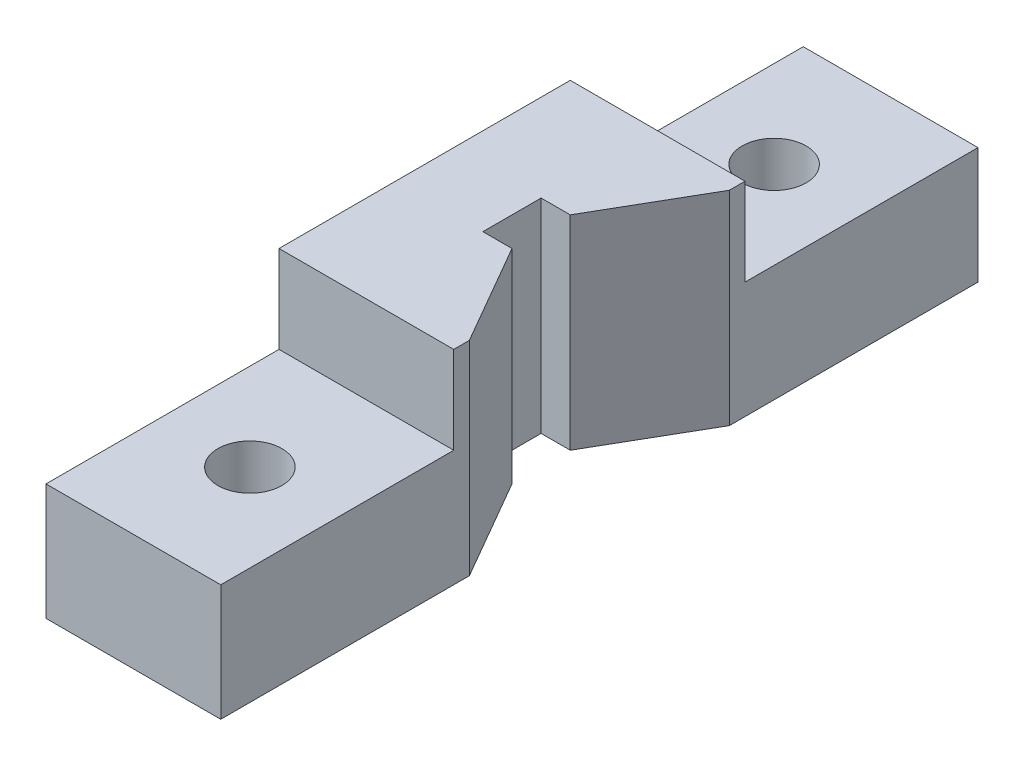
ISO-10303-21;
HEADER;
FILE_DESCRIPTION(('STEP AP214'),'2;1');
FILE_NAME('part.step','',(''),(''),'','','');
FILE_SCHEMA(('AUTOMOTIVE_DESIGN { 1 0 10303 214 1 1 1 1 }'));
ENDSEC;
DATA;
#1=APPLICATION_CONTEXT('core data for automotive mechanical design processes');
#2=APPLICATION_PROTOCOL_DEFINITION('international standard','automotive_design',2000,#1);
#3=PRODUCT_CONTEXT('',#1,'mechanical');
#4=PRODUCT('Part','Part','',(#3));
#5=PRODUCT_RELATED_PRODUCT_CATEGORY('part','',(#4));
#6=PRODUCT_DEFINITION_FORMATION('','',#4);
#7=PRODUCT_DEFINITION_CONTEXT('part definition',#1,'design');
#8=PRODUCT_DEFINITION('design','',#6,#7);
#9=PRODUCT_DEFINITION_SHAPE('','',#8);
#10=(LENGTH_UNIT() NAMED_UNIT(*) SI_UNIT(.MILLI.,.METRE.));
#11=(NAMED_UNIT(*) PLANE_ANGLE_UNIT() SI_UNIT($,.RADIAN.));
#12=(NAMED_UNIT(*) SI_UNIT($,.STERADIAN.) SOLID_ANGLE_UNIT());
#13=UNCERTAINTY_MEASURE_WITH_UNIT(LENGTH_MEASURE(1.E-05),#10,'distance_accuracy_value','');
#14=(GEOMETRIC_REPRESENTATION_CONTEXT(3) GLOBAL_UNCERTAINTY_ASSIGNED_CONTEXT((#13)) GLOBAL_UNIT_ASSIGNED_CONTEXT((#10,
#11,#12)) REPRESENTATION_CONTEXT('',''));
#15=CARTESIAN_POINT('',(0.,0.,0.));
#16=DIRECTION('',(0.,0.,1.));
#17=DIRECTION('',(1.,0.,0.));
#18=AXIS2_PLACEMENT_3D('',#15,#16,#17);
#19=CARTESIAN_POINT('',(0.,50.,35.));
#20=DIRECTION('',(0.,1.,0.));
#21=DIRECTION('',(0.,0.,1.));
#22=AXIS2_PLACEMENT_3D('',#19,#20,#21);
#23=PLANE('',#22);
#24=CARTESIAN_POINT('',(15.,50.,145.));
#25=DIRECTION('',(0.,1.,0.));
#26=DIRECTION('',(0.,0.,1.));
#27=AXIS2_PLACEMENT_3D('',#24,#25,#26);
#28=CIRCLE('',#27,5.5);
#29=CARTESIAN_POINT('',(15.,50.,150.5));
#30=VERTEX_POINT('',#29);
#31=EDGE_CURVE('E11',#30,#30,#28,.T.);
#32=ORIENTED_EDGE('',*,*,#31,.T.);
#33=EDGE_LOOP('',(#32));
#34=FACE_BOUND('',#33,.T.);
#35=CARTESIAN_POINT('',(15.,50.,55.));
#36=DIRECTION('',(0.,1.,0.));
#37=DIRECTION('',(0.,0.,1.));
#38=AXIS2_PLACEMENT_3D('',#35,#36,#37);
#39=CIRCLE('',#38,5.5);
#40=CARTESIAN_POINT('',(15.,50.,60.5));
#41=VERTEX_POINT('',#40);
#42=EDGE_CURVE('E52',#41,#41,#39,.T.);
#43=ORIENTED_EDGE('',*,*,#42,.T.);
#44=EDGE_LOOP('',(#43));
#45=FACE_BOUND('',#44,.T.);
#46=DIRECTION('',(0.,0.,1.));
#47=VECTOR('',#46,1.);
#48=CARTESIAN_POINT('',(0.,50.,200.));
#49=LINE('',#48,#47);
#50=CARTESIAN_POINT('',(0.,50.,35.));
#51=VERTEX_POINT('',#50);
#52=CARTESIAN_POINT('',(0.,50.,165.));
#53=VERTEX_POINT('',#52);
#54=EDGE_CURVE('E48',#51,#53,#49,.T.);
#55=ORIENTED_EDGE('',*,*,#54,.F.);
#56=DIRECTION('',(1.,0.,0.));
#57=VECTOR('',#56,1.);
#58=CARTESIAN_POINT('',(0.,50.,35.));
#59=LINE('',#58,#57);
#60=CARTESIAN_POINT('',(30.,50.,35.));
#61=VERTEX_POINT('',#60);
#62=EDGE_CURVE('E62',#51,#61,#59,.T.);
#63=ORIENTED_EDGE('',*,*,#62,.T.);
#64=DIRECTION('',(0.,0.,-1.));
#65=VECTOR('',#64,1.);
#66=CARTESIAN_POINT('',(30.,50.,75.));
#67=LINE('',#66,#65);
#68=CARTESIAN_POINT('',(30.,50.,77.6794919243111));
#69=VERTEX_POINT('',#68);
#70=EDGE_CURVE('E66',#69,#61,#67,.T.);
#71=ORIENTED_EDGE('',*,*,#70,.F.);
#72=DIRECTION('',(0.499999999999998,0.,-0.86602540378444));
#73=VECTOR('',#72,1.);
#74=CARTESIAN_POINT('',(30.,50.,77.6794919243111));
#75=LINE('',#74,#73);
#76=CARTESIAN_POINT('',(20.,50.,95.));
#77=VERTEX_POINT('',#76);
#78=EDGE_CURVE('E237',#77,#69,#75,.T.);
#79=ORIENTED_EDGE('',*,*,#78,.F.);
#80=DIRECTION('',(1.,0.,0.));
#81=VECTOR('',#80,1.);
#82=CARTESIAN_POINT('',(20.,50.,95.));
#83=LINE('',#82,#81);
#84=CARTESIAN_POINT('',(15.,50.,95.));
#85=VERTEX_POINT('',#84);
#86=EDGE_CURVE('E240',#85,#77,#83,.T.);
#87=ORIENTED_EDGE('',*,*,#86,.F.);
#88=DIRECTION('',(0.,0.,-1.));
#89=VECTOR('',#88,1.);
#90=CARTESIAN_POINT('',(15.,50.,95.));
#91=LINE('',#90,#89);
#92=CARTESIAN_POINT('',(15.,50.,105.));
#93=VERTEX_POINT('',#92);
#94=EDGE_CURVE('E232',#93,#85,#91,.T.);
#95=ORIENTED_EDGE('',*,*,#94,.F.);
#96=DIRECTION('',(-1.,0.,0.));
#97=VECTOR('',#96,1.);
#98=CARTESIAN_POINT('',(20.,50.,105.));
#99=LINE('',#98,#97);
#100=CARTESIAN_POINT('',(20.,50.,105.));
#101=VERTEX_POINT('',#100);
#102=EDGE_CURVE('E231',#101,#93,#99,.T.);
#103=ORIENTED_EDGE('',*,*,#102,.F.);
#104=DIRECTION('',(-0.499999999999998,0.,-0.86602540378444));
#105=VECTOR('',#104,1.);
#106=CARTESIAN_POINT('',(30.,50.,122.320508075689));
#107=LINE('',#106,#105);
#108=CARTESIAN_POINT('',(30.,50.,122.320508075689));
#109=VERTEX_POINT('',#108);
#110=EDGE_CURVE('E233',#109,#101,#107,.T.);
#111=ORIENTED_EDGE('',*,*,#110,.F.);
#112=DIRECTION('',(0.,0.,-1.));
#113=VECTOR('',#112,1.);
#114=CARTESIAN_POINT('',(30.,50.,122.320508075689));
#115=LINE('',#114,#113);
#116=CARTESIAN_POINT('',(30.,50.,165.));
#117=VERTEX_POINT('',#116);
#118=EDGE_CURVE('E189',#117,#109,#115,.T.);
#119=ORIENTED_EDGE('',*,*,#118,.F.);
#120=DIRECTION('',(1.,0.,0.));
#121=VECTOR('',#120,1.);
#122=CARTESIAN_POINT('',(0.,50.,165.));
#123=LINE('',#122,#121);
#124=EDGE_CURVE('E194',#53,#117,#123,.T.);
#125=ORIENTED_EDGE('',*,*,#124,.F.);
#126=EDGE_LOOP('',(#55,#63,#71,#79,#87,#95,#103,#111,#119,#125));
#127=FACE_BOUND('',#126,.T.);
#128=ADVANCED_FACE('F44',(#34,#45,#127),#23,.F.);
#129=CARTESIAN_POINT('',(0.,85.,125.));
#130=DIRECTION('',(0.,0.,-1.));
#131=DIRECTION('',(-1.,0.,0.));
#132=AXIS2_PLACEMENT_3D('',#129,#130,#131);
#133=PLANE('',#132);
#134=DIRECTION('',(-1.,0.,0.));
#135=VECTOR('',#134,1.);
#136=CARTESIAN_POINT('',(0.,70.,125.));
#137=LINE('',#136,#135);
#138=CARTESIAN_POINT('',(30.,70.,125.));
#139=VERTEX_POINT('',#138);
#140=CARTESIAN_POINT('',(0.,70.,125.));
#141=VERTEX_POINT('',#140);
#142=EDGE_CURVE('E197',#139,#141,#137,.T.);
#143=ORIENTED_EDGE('',*,*,#142,.F.);
#144=DIRECTION('',(0.,-1.,0.));
#145=VECTOR('',#144,1.);
#146=CARTESIAN_POINT('',(30.,85.,125.));
#147=LINE('',#146,#145);
#148=CARTESIAN_POINT('',(30.,85.,125.));
#149=VERTEX_POINT('',#148);
#150=EDGE_CURVE('E256',#149,#139,#147,.T.);
#151=ORIENTED_EDGE('',*,*,#150,.F.);
#152=DIRECTION('',(1.,0.,0.));
#153=VECTOR('',#152,1.);
#154=CARTESIAN_POINT('',(0.,85.,125.));
#155=LINE('',#154,#153);
#156=CARTESIAN_POINT('',(0.,85.,125.));
#157=VERTEX_POINT('',#156);
#158=EDGE_CURVE('E214',#157,#149,#155,.T.);
#159=ORIENTED_EDGE('',*,*,#158,.F.);
#160=DIRECTION('',(0.,-1.,0.));
#161=VECTOR('',#160,1.);
#162=CARTESIAN_POINT('',(0.,85.,125.));
#163=LINE('',#162,#161);
#164=EDGE_CURVE('E262',#157,#141,#163,.T.);
#165=ORIENTED_EDGE('',*,*,#164,.T.);
#166=EDGE_LOOP('',(#143,#151,#159,#165));
#167=FACE_BOUND('',#166,.T.);
#168=ADVANCED_FACE('F305',(#167),#133,.F.);
#169=CARTESIAN_POINT('',(30.,85.,122.320508075689));
#170=DIRECTION('',(-0.86602540378444,0.,0.499999999999998));
#171=DIRECTION('',(0.499999999999998,0.,0.86602540378444));
#172=AXIS2_PLACEMENT_3D('',#169,#170,#171);
#173=PLANE('',#172);
#174=ORIENTED_EDGE('',*,*,#110,.T.);
#175=DIRECTION('',(0.,-1.,0.));
#176=VECTOR('',#175,1.);
#177=CARTESIAN_POINT('',(20.,85.,105.));
#178=LINE('',#177,#176);
#179=CARTESIAN_POINT('',(20.,85.,105.));
#180=VERTEX_POINT('',#179);
#181=EDGE_CURVE('E254',#180,#101,#178,.T.);
#182=ORIENTED_EDGE('',*,*,#181,.F.);
#183=DIRECTION('',(-0.499999999999998,0.,-0.86602540378444));
#184=VECTOR('',#183,1.);
#185=CARTESIAN_POINT('',(30.,85.,122.320508075689));
#186=LINE('',#185,#184);
#187=CARTESIAN_POINT('',(30.,85.,122.320508075689));
#188=VERTEX_POINT('',#187);
#189=EDGE_CURVE('E220',#188,#180,#186,.T.);
#190=ORIENTED_EDGE('',*,*,#189,.F.);
#191=DIRECTION('',(0.,-1.,0.));
#192=VECTOR('',#191,1.);
#193=CARTESIAN_POINT('',(30.,85.,122.320508075689));
#194=LINE('',#193,#192);
#195=EDGE_CURVE('E257',#188,#109,#194,.T.);
#196=ORIENTED_EDGE('',*,*,#195,.T.);
#197=EDGE_LOOP('',(#174,#182,#190,#196));
#198=FACE_BOUND('',#197,.T.);
#199=ADVANCED_FACE('F307',(#198),#173,.F.);
#200=CARTESIAN_POINT('',(20.,85.,105.));
#201=DIRECTION('',(0.,0.,1.));
#202=DIRECTION('',(1.,0.,0.));
#203=AXIS2_PLACEMENT_3D('',#200,#201,#202);
#204=PLANE('',#203);
#205=ORIENTED_EDGE('',*,*,#102,.T.);
#206=DIRECTION('',(0.,-1.,0.));
#207=VECTOR('',#206,1.);
#208=CARTESIAN_POINT('',(15.,85.,105.));
#209=LINE('',#208,#207);
#210=CARTESIAN_POINT('',(15.,85.,105.));
#211=VERTEX_POINT('',#210);
#212=EDGE_CURVE('E249',#211,#93,#209,.T.);
#213=ORIENTED_EDGE('',*,*,#212,.F.);
#214=DIRECTION('',(-1.,0.,0.));
#215=VECTOR('',#214,1.);
#216=CARTESIAN_POINT('',(20.,85.,105.));
#217=LINE('',#216,#215);
#218=EDGE_CURVE('E216',#180,#211,#217,.T.);
#219=ORIENTED_EDGE('',*,*,#218,.F.);
#220=ORIENTED_EDGE('',*,*,#181,.T.);
#221=EDGE_LOOP('',(#205,#213,#219,#220));
#222=FACE_BOUND('',#221,.T.);
#223=ADVANCED_FACE('F339',(#222),#204,.F.);
#224=CARTESIAN_POINT('',(15.,85.,95.));
#225=DIRECTION('',(-1.,0.,0.));
#226=DIRECTION('',(0.,0.,1.));
#227=AXIS2_PLACEMENT_3D('',#224,#225,#226);
#228=PLANE('',#227);
#229=ORIENTED_EDGE('',*,*,#94,.T.);
#230=DIRECTION('',(0.,-1.,0.));
#231=VECTOR('',#230,1.);
#232=CARTESIAN_POINT('',(15.,85.,95.));
#233=LINE('',#232,#231);
#234=CARTESIAN_POINT('',(15.,85.,95.));
#235=VERTEX_POINT('',#234);
#236=EDGE_CURVE('E250',#235,#85,#233,.T.);
#237=ORIENTED_EDGE('',*,*,#236,.F.);
#238=DIRECTION('',(0.,0.,-1.));
#239=VECTOR('',#238,1.);
#240=CARTESIAN_POINT('',(15.,85.,105.));
#241=LINE('',#240,#239);
#242=EDGE_CURVE('E221',#211,#235,#241,.T.);
#243=ORIENTED_EDGE('',*,*,#242,.F.);
#244=ORIENTED_EDGE('',*,*,#212,.T.);
#245=EDGE_LOOP('',(#229,#237,#243,#244));
#246=FACE_BOUND('',#245,.T.);
#247=ADVANCED_FACE('F335',(#246),#228,.F.);
#248=CARTESIAN_POINT('',(20.,85.,95.));
#249=DIRECTION('',(0.,0.,-1.));
#250=DIRECTION('',(-1.,0.,0.));
#251=AXIS2_PLACEMENT_3D('',#248,#249,#250);
#252=PLANE('',#251);
#253=ORIENTED_EDGE('',*,*,#86,.T.);
#254=DIRECTION('',(0.,-1.,0.));
#255=VECTOR('',#254,1.);
#256=CARTESIAN_POINT('',(20.,85.,95.));
#257=LINE('',#256,#255);
#258=CARTESIAN_POINT('',(20.,85.,95.));
#259=VERTEX_POINT('',#258);
#260=EDGE_CURVE('E242',#259,#77,#257,.T.);
#261=ORIENTED_EDGE('',*,*,#260,.F.);
#262=DIRECTION('',(1.,0.,0.));
#263=VECTOR('',#262,1.);
#264=CARTESIAN_POINT('',(20.,85.,95.));
#265=LINE('',#264,#263);
#266=EDGE_CURVE('E224',#235,#259,#265,.T.);
#267=ORIENTED_EDGE('',*,*,#266,.F.);
#268=ORIENTED_EDGE('',*,*,#236,.T.);
#269=EDGE_LOOP('',(#253,#261,#267,#268));
#270=FACE_BOUND('',#269,.T.);
#271=ADVANCED_FACE('F332',(#270),#252,.F.);
#272=CARTESIAN_POINT('',(30.,85.,77.6794919243111));
#273=DIRECTION('',(-0.86602540378444,0.,-0.499999999999998));
#274=DIRECTION('',(-0.499999999999998,0.,0.86602540378444));
#275=AXIS2_PLACEMENT_3D('',#272,#273,#274);
#276=PLANE('',#275);
#277=ORIENTED_EDGE('',*,*,#78,.T.);
#278=DIRECTION('',(0.,-1.,0.));
#279=VECTOR('',#278,1.);
#280=CARTESIAN_POINT('',(30.,85.,77.6794919243111));
#281=LINE('',#280,#279);
#282=CARTESIAN_POINT('',(30.,85.,77.6794919243111));
#283=VERTEX_POINT('',#282);
#284=EDGE_CURVE('E159',#283,#69,#281,.T.);
#285=ORIENTED_EDGE('',*,*,#284,.F.);
#286=DIRECTION('',(0.499999999999998,0.,-0.86602540378444));
#287=VECTOR('',#286,1.);
#288=CARTESIAN_POINT('',(30.,85.,77.6794919243111));
#289=LINE('',#288,#287);
#290=EDGE_CURVE('E225',#259,#283,#289,.T.);
#291=ORIENTED_EDGE('',*,*,#290,.F.);
#292=ORIENTED_EDGE('',*,*,#260,.T.);
#293=EDGE_LOOP('',(#277,#285,#291,#292));
#294=FACE_BOUND('',#293,.T.);
#295=ADVANCED_FACE('F281',(#294),#276,.F.);
#296=CARTESIAN_POINT('',(0.,85.,0.));
#297=DIRECTION('',(0.,1.,0.));
#298=DIRECTION('',(0.,0.,1.));
#299=AXIS2_PLACEMENT_3D('',#296,#297,#298);
#300=PLANE('',#299);
#301=DIRECTION('',(0.,0.,1.));
#302=VECTOR('',#301,1.);
#303=CARTESIAN_POINT('',(0.,85.,75.));
#304=LINE('',#303,#302);
#305=CARTESIAN_POINT('',(0.,85.,75.));
#306=VERTEX_POINT('',#305);
#307=EDGE_CURVE('E208',#306,#157,#304,.T.);
#308=ORIENTED_EDGE('',*,*,#307,.T.);
#309=ORIENTED_EDGE('',*,*,#158,.T.);
#310=DIRECTION('',(0.,0.,-1.));
#311=VECTOR('',#310,1.);
#312=CARTESIAN_POINT('',(30.,85.,122.320508075689));
#313=LINE('',#312,#311);
#314=EDGE_CURVE('E213',#149,#188,#313,.T.);
#315=ORIENTED_EDGE('',*,*,#314,.T.);
#316=ORIENTED_EDGE('',*,*,#189,.T.);
#317=ORIENTED_EDGE('',*,*,#218,.T.);
#318=ORIENTED_EDGE('',*,*,#242,.T.);
#319=ORIENTED_EDGE('',*,*,#266,.T.);
#320=ORIENTED_EDGE('',*,*,#290,.T.);
#321=DIRECTION('',(0.,0.,-1.));
#322=VECTOR('',#321,1.);
#323=CARTESIAN_POINT('',(30.,85.,75.));
#324=LINE('',#323,#322);
#325=CARTESIAN_POINT('',(30.,85.,75.));
#326=VERTEX_POINT('',#325);
#327=EDGE_CURVE('E227',#283,#326,#324,.T.);
#328=ORIENTED_EDGE('',*,*,#327,.T.);
#329=DIRECTION('',(-1.,0.,0.));
#330=VECTOR('',#329,1.);
#331=CARTESIAN_POINT('',(0.,85.,75.));
#332=LINE('',#331,#330);
#333=EDGE_CURVE('E156',#326,#306,#332,.T.);
#334=ORIENTED_EDGE('',*,*,#333,.T.);
#335=EDGE_LOOP('',(#308,#309,#315,#316,#317,#318,#319,#320,#328,#334));
#336=FACE_BOUND('',#335,.T.);
#337=ADVANCED_FACE('F276',(#336),#300,.T.);
#338=CARTESIAN_POINT('',(0.,85.,75.));
#339=DIRECTION('',(0.,0.,1.));
#340=DIRECTION('',(1.,0.,0.));
#341=AXIS2_PLACEMENT_3D('',#338,#339,#340);
#342=PLANE('',#341);
#343=DIRECTION('',(1.,0.,0.));
#344=VECTOR('',#343,1.);
#345=CARTESIAN_POINT('',(0.,70.,75.));
#346=LINE('',#345,#344);
#347=CARTESIAN_POINT('',(0.,70.,75.));
#348=VERTEX_POINT('',#347);
#349=CARTESIAN_POINT('',(30.,70.,75.));
#350=VERTEX_POINT('',#349);
#351=EDGE_CURVE('E151',#348,#350,#346,.T.);
#352=ORIENTED_EDGE('',*,*,#351,.F.);
#353=DIRECTION('',(0.,-1.,0.));
#354=VECTOR('',#353,1.);
#355=CARTESIAN_POINT('',(0.,85.,75.));
#356=LINE('',#355,#354);
#357=EDGE_CURVE('E158',#306,#348,#356,.T.);
#358=ORIENTED_EDGE('',*,*,#357,.F.);
#359=ORIENTED_EDGE('',*,*,#333,.F.);
#360=DIRECTION('',(0.,-1.,0.));
#361=VECTOR('',#360,1.);
#362=CARTESIAN_POINT('',(30.,85.,75.));
#363=LINE('',#362,#361);
#364=EDGE_CURVE('E146',#326,#350,#363,.T.);
#365=ORIENTED_EDGE('',*,*,#364,.T.);
#366=EDGE_LOOP('',(#352,#358,#359,#365));
#367=FACE_BOUND('',#366,.T.);
#368=ADVANCED_FACE('F152',(#367),#342,.F.);
#369=CARTESIAN_POINT('',(30.,85.,75.));
#370=DIRECTION('',(-1.,0.,0.));
#371=DIRECTION('',(0.,0.,1.));
#372=AXIS2_PLACEMENT_3D('',#369,#370,#371);
#373=PLANE('',#372);
#374=ORIENTED_EDGE('',*,*,#70,.T.);
#375=DIRECTION('',(0.,-1.,0.));
#376=VECTOR('',#375,1.);
#377=CARTESIAN_POINT('',(30.,70.,35.));
#378=LINE('',#377,#376);
#379=CARTESIAN_POINT('',(30.,70.,35.));
#380=VERTEX_POINT('',#379);
#381=EDGE_CURVE('E161',#380,#61,#378,.T.);
#382=ORIENTED_EDGE('',*,*,#381,.F.);
#383=DIRECTION('',(0.,0.,-1.));
#384=VECTOR('',#383,1.);
#385=CARTESIAN_POINT('',(30.,70.,0.));
#386=LINE('',#385,#384);
#387=EDGE_CURVE('E163',#350,#380,#386,.T.);
#388=ORIENTED_EDGE('',*,*,#387,.F.);
#389=ORIENTED_EDGE('',*,*,#364,.F.);
#390=ORIENTED_EDGE('',*,*,#327,.F.);
#391=ORIENTED_EDGE('',*,*,#284,.T.);
#392=EDGE_LOOP('',(#374,#382,#388,#389,#390,#391));
#393=FACE_BOUND('',#392,.T.);
#394=ADVANCED_FACE('F162',(#393),#373,.F.);
#395=CARTESIAN_POINT('',(0.,70.,0.));
#396=DIRECTION('',(0.,1.,0.));
#397=DIRECTION('',(0.,0.,1.));
#398=AXIS2_PLACEMENT_3D('',#395,#396,#397);
#399=PLANE('',#398);
#400=CARTESIAN_POINT('',(15.,70.,55.));
#401=DIRECTION('',(0.,1.,0.));
#402=DIRECTION('',(0.,0.,1.));
#403=AXIS2_PLACEMENT_3D('',#400,#401,#402);
#404=CIRCLE('',#403,5.5);
#405=CARTESIAN_POINT('',(15.,70.,60.5));
#406=VERTEX_POINT('',#405);
#407=EDGE_CURVE('E173',#406,#406,#404,.T.);
#408=ORIENTED_EDGE('',*,*,#407,.F.);
#409=EDGE_LOOP('',(#408));
#410=FACE_BOUND('',#409,.T.);
#411=ORIENTED_EDGE('',*,*,#351,.T.);
#412=ORIENTED_EDGE('',*,*,#387,.T.);
#413=DIRECTION('',(1.,0.,0.));
#414=VECTOR('',#413,1.);
#415=CARTESIAN_POINT('',(0.,70.,35.));
#416=LINE('',#415,#414);
#417=CARTESIAN_POINT('',(0.,70.,35.));
#418=VERTEX_POINT('',#417);
#419=EDGE_CURVE('E170',#418,#380,#416,.T.);
#420=ORIENTED_EDGE('',*,*,#419,.F.);
#421=DIRECTION('',(0.,0.,1.));
#422=VECTOR('',#421,1.);
#423=CARTESIAN_POINT('',(0.,70.,0.));
#424=LINE('',#423,#422);
#425=EDGE_CURVE('E175',#418,#348,#424,.T.);
#426=ORIENTED_EDGE('',*,*,#425,.T.);
#427=EDGE_LOOP('',(#411,#412,#420,#426));
#428=FACE_BOUND('',#427,.T.);
#429=ADVANCED_FACE('F167',(#410,#428),#399,.T.);
#430=CARTESIAN_POINT('',(0.,0.,200.));
#431=DIRECTION('',(1.,0.,0.));
#432=DIRECTION('',(0.,0.,-1.));
#433=AXIS2_PLACEMENT_3D('',#430,#431,#432);
#434=PLANE('',#433);
#435=DIRECTION('',(0.,-1.,0.));
#436=VECTOR('',#435,1.);
#437=CARTESIAN_POINT('',(0.,70.,35.));
#438=LINE('',#437,#436);
#439=EDGE_CURVE('E181',#418,#51,#438,.T.);
#440=ORIENTED_EDGE('',*,*,#439,.T.);
#441=ORIENTED_EDGE('',*,*,#54,.T.);
#442=DIRECTION('',(0.,-1.,0.));
#443=VECTOR('',#442,1.);
#444=CARTESIAN_POINT('',(0.,70.,165.));
#445=LINE('',#444,#443);
#446=CARTESIAN_POINT('',(0.,70.,165.));
#447=VERTEX_POINT('',#446);
#448=EDGE_CURVE('E176',#447,#53,#445,.T.);
#449=ORIENTED_EDGE('',*,*,#448,.F.);
#450=DIRECTION('',(0.,0.,1.));
#451=VECTOR('',#450,1.);
#452=CARTESIAN_POINT('',(0.,70.,0.));
#453=LINE('',#452,#451);
#454=EDGE_CURVE('E196',#141,#447,#453,.T.);
#455=ORIENTED_EDGE('',*,*,#454,.F.);
#456=ORIENTED_EDGE('',*,*,#164,.F.);
#457=ORIENTED_EDGE('',*,*,#307,.F.);
#458=ORIENTED_EDGE('',*,*,#357,.T.);
#459=ORIENTED_EDGE('',*,*,#425,.F.);
#460=EDGE_LOOP('',(#440,#441,#449,#455,#456,#457,#458,#459));
#461=FACE_BOUND('',#460,.T.);
#462=ADVANCED_FACE('F269',(#461),#434,.F.);
#463=CARTESIAN_POINT('',(0.,70.,35.));
#464=DIRECTION('',(0.,0.,-1.));
#465=DIRECTION('',(-1.,0.,0.));
#466=AXIS2_PLACEMENT_3D('',#463,#464,#465);
#467=PLANE('',#466);
#468=ORIENTED_EDGE('',*,*,#62,.F.);
#469=ORIENTED_EDGE('',*,*,#439,.F.);
#470=ORIENTED_EDGE('',*,*,#419,.T.);
#471=ORIENTED_EDGE('',*,*,#381,.T.);
#472=EDGE_LOOP('',(#468,#469,#470,#471));
#473=FACE_BOUND('',#472,.T.);
#474=ADVANCED_FACE('F289',(#473),#467,.T.);
#475=CARTESIAN_POINT('',(0.,70.,0.));
#476=DIRECTION('',(0.,1.,0.));
#477=DIRECTION('',(0.,0.,1.));
#478=AXIS2_PLACEMENT_3D('',#475,#476,#477);
#479=PLANE('',#478);
#480=CARTESIAN_POINT('',(15.,70.,145.));
#481=DIRECTION('',(0.,1.,0.));
#482=DIRECTION('',(0.,0.,1.));
#483=AXIS2_PLACEMENT_3D('',#480,#481,#482);
#484=CIRCLE('',#483,5.5);
#485=CARTESIAN_POINT('',(15.,70.,150.5));
#486=VERTEX_POINT('',#485);
#487=EDGE_CURVE('E186',#486,#486,#484,.T.);
#488=ORIENTED_EDGE('',*,*,#487,.F.);
#489=EDGE_LOOP('',(#488));
#490=FACE_BOUND('',#489,.T.);
#491=DIRECTION('',(0.,0.,1.));
#492=VECTOR('',#491,1.);
#493=CARTESIAN_POINT('',(30.,70.,0.));
#494=LINE('',#493,#492);
#495=CARTESIAN_POINT('',(30.,70.,165.));
#496=VERTEX_POINT('',#495);
#497=EDGE_CURVE('E195',#139,#496,#494,.T.);
#498=ORIENTED_EDGE('',*,*,#497,.F.);
#499=ORIENTED_EDGE('',*,*,#142,.T.);
#500=ORIENTED_EDGE('',*,*,#454,.T.);
#501=DIRECTION('',(1.,0.,0.));
#502=VECTOR('',#501,1.);
#503=CARTESIAN_POINT('',(0.,70.,165.));
#504=LINE('',#503,#502);
#505=EDGE_CURVE('E202',#447,#496,#504,.T.);
#506=ORIENTED_EDGE('',*,*,#505,.T.);
#507=EDGE_LOOP('',(#498,#499,#500,#506));
#508=FACE_BOUND('',#507,.T.);
#509=ADVANCED_FACE('F277',(#490,#508),#479,.T.);
#510=CARTESIAN_POINT('',(30.,85.,122.320508075689));
#511=DIRECTION('',(-1.,0.,0.));
#512=DIRECTION('',(0.,0.,1.));
#513=AXIS2_PLACEMENT_3D('',#510,#511,#512);
#514=PLANE('',#513);
#515=ORIENTED_EDGE('',*,*,#118,.T.);
#516=ORIENTED_EDGE('',*,*,#195,.F.);
#517=ORIENTED_EDGE('',*,*,#314,.F.);
#518=ORIENTED_EDGE('',*,*,#150,.T.);
#519=ORIENTED_EDGE('',*,*,#497,.T.);
#520=DIRECTION('',(0.,-1.,0.));
#521=VECTOR('',#520,1.);
#522=CARTESIAN_POINT('',(30.,70.,165.));
#523=LINE('',#522,#521);
#524=EDGE_CURVE('E204',#496,#117,#523,.T.);
#525=ORIENTED_EDGE('',*,*,#524,.T.);
#526=EDGE_LOOP('',(#515,#516,#517,#518,#519,#525));
#527=FACE_BOUND('',#526,.T.);
#528=ADVANCED_FACE('F298',(#527),#514,.F.);
#529=CARTESIAN_POINT('',(0.,70.,165.));
#530=DIRECTION('',(0.,0.,-1.));
#531=DIRECTION('',(-1.,0.,0.));
#532=AXIS2_PLACEMENT_3D('',#529,#530,#531);
#533=PLANE('',#532);
#534=ORIENTED_EDGE('',*,*,#124,.T.);
#535=ORIENTED_EDGE('',*,*,#524,.F.);
#536=ORIENTED_EDGE('',*,*,#505,.F.);
#537=ORIENTED_EDGE('',*,*,#448,.T.);
#538=EDGE_LOOP('',(#534,#535,#536,#537));
#539=FACE_BOUND('',#538,.T.);
#540=ADVANCED_FACE('F272',(#539),#533,.F.);
#541=CARTESIAN_POINT('',(15.,70.,55.));
#542=DIRECTION('',(0.,-1.,0.));
#543=DIRECTION('',(0.,0.,-1.));
#544=AXIS2_PLACEMENT_3D('',#541,#542,#543);
#545=CYLINDRICAL_SURFACE('',#544,5.5);
#546=ORIENTED_EDGE('',*,*,#407,.T.);
#547=EDGE_LOOP('',(#546));
#548=FACE_BOUND('',#547,.T.);
#549=ORIENTED_EDGE('',*,*,#42,.F.);
#550=EDGE_LOOP('',(#549));
#551=FACE_BOUND('',#550,.T.);
#552=ADVANCED_FACE('F312',(#548,#551),#545,.F.);
#553=CARTESIAN_POINT('',(15.,70.,145.));
#554=DIRECTION('',(0.,-1.,0.));
#555=DIRECTION('',(0.,0.,-1.));
#556=AXIS2_PLACEMENT_3D('',#553,#554,#555);
#557=CYLINDRICAL_SURFACE('',#556,5.5);
#558=ORIENTED_EDGE('',*,*,#487,.T.);
#559=EDGE_LOOP('',(#558));
#560=FACE_BOUND('',#559,.T.);
#561=ORIENTED_EDGE('',*,*,#31,.F.);
#562=EDGE_LOOP('',(#561));
#563=FACE_BOUND('',#562,.T.);
#564=ADVANCED_FACE('F302',(#560,#563),#557,.F.);
#565=CLOSED_SHELL('',(#128,#168,#199,#223,#247,#271,#295,#337,#368,#394,#429,#462,#474,#509,
#528,#540,#552,#564));
#566=MANIFOLD_SOLID_BREP('B2',#565);
#567=ADVANCED_BREP_SHAPE_REPRESENTATION('',(#18,#566),#14);
#568=SHAPE_DEFINITION_REPRESENTATION(#9,#567);
ENDSEC;
END-ISO-10303-21;
